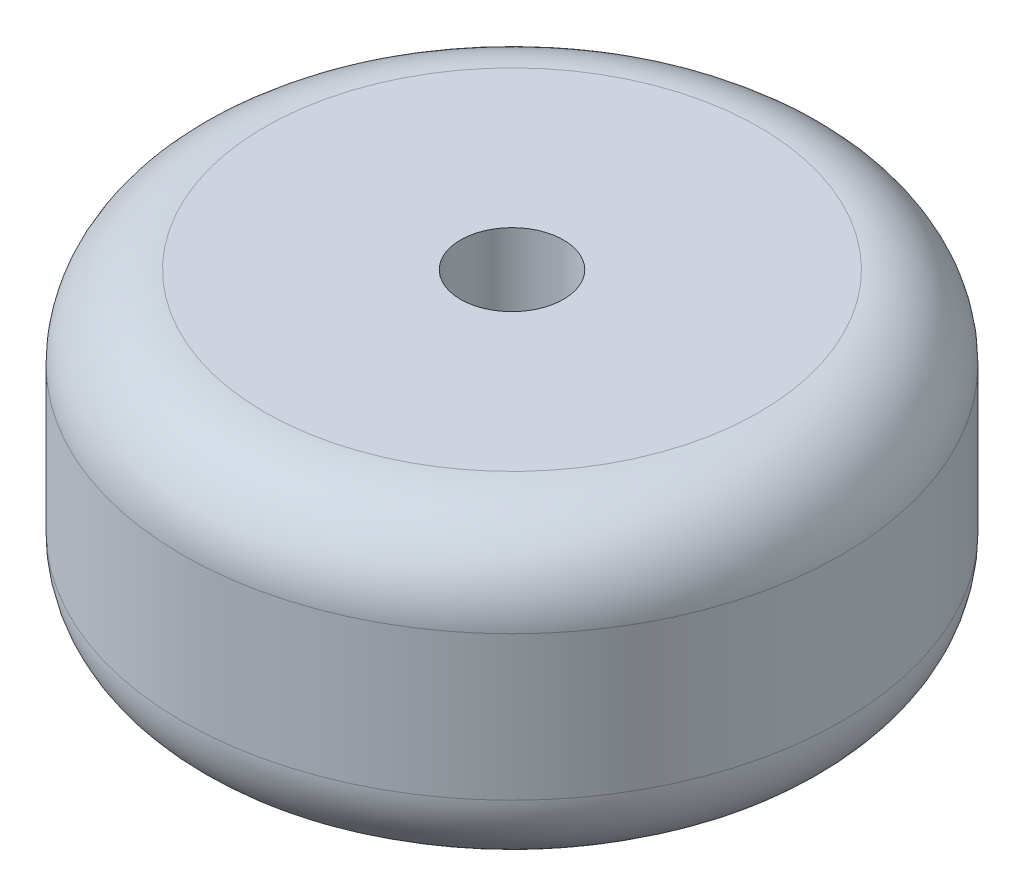
ISO-10303-21;
HEADER;
FILE_DESCRIPTION(('STEP AP214'),'2;1');
FILE_NAME('part.step','',(''),(''),'','','');
FILE_SCHEMA(('AUTOMOTIVE_DESIGN { 1 0 10303 214 1 1 1 1 }'));
ENDSEC;
DATA;
#1=APPLICATION_CONTEXT('core data for automotive mechanical design processes');
#2=APPLICATION_PROTOCOL_DEFINITION('international standard','automotive_design',2000,#1);
#3=PRODUCT_CONTEXT('',#1,'mechanical');
#4=PRODUCT('Part','Part','',(#3));
#5=PRODUCT_RELATED_PRODUCT_CATEGORY('part','',(#4));
#6=PRODUCT_DEFINITION_FORMATION('','',#4);
#7=PRODUCT_DEFINITION_CONTEXT('part definition',#1,'design');
#8=PRODUCT_DEFINITION('design','',#6,#7);
#9=PRODUCT_DEFINITION_SHAPE('','',#8);
#10=(LENGTH_UNIT() NAMED_UNIT(*) SI_UNIT(.MILLI.,.METRE.));
#11=(NAMED_UNIT(*) PLANE_ANGLE_UNIT() SI_UNIT($,.RADIAN.));
#12=(NAMED_UNIT(*) SI_UNIT($,.STERADIAN.) SOLID_ANGLE_UNIT());
#13=UNCERTAINTY_MEASURE_WITH_UNIT(LENGTH_MEASURE(1.E-05),#10,'distance_accuracy_value','');
#14=(GEOMETRIC_REPRESENTATION_CONTEXT(3) GLOBAL_UNCERTAINTY_ASSIGNED_CONTEXT((#13)) GLOBAL_UNIT_ASSIGNED_CONTEXT((#10,
#11,#12)) REPRESENTATION_CONTEXT('',''));
#15=CARTESIAN_POINT('',(0.,0.,0.));
#16=DIRECTION('',(0.,0.,1.));
#17=DIRECTION('',(1.,0.,0.));
#18=AXIS2_PLACEMENT_3D('',#15,#16,#17);
#19=CARTESIAN_POINT('',(0.,15.,0.));
#20=DIRECTION('',(0.,1.,0.));
#21=DIRECTION('',(0.,0.,1.));
#22=AXIS2_PLACEMENT_3D('',#19,#20,#21);
#23=PLANE('',#22);
#24=CARTESIAN_POINT('',(0.,15.,0.));
#25=DIRECTION('',(0.,1.,0.));
#26=DIRECTION('',(0.,0.,1.));
#27=AXIS2_PLACEMENT_3D('',#24,#25,#26);
#28=CIRCLE('',#27,12.);
#29=CARTESIAN_POINT('',(0.,15.,12.));
#30=VERTEX_POINT('',#29);
#31=EDGE_CURVE('E10',#30,#30,#28,.T.);
#32=ORIENTED_EDGE('',*,*,#31,.T.);
#33=EDGE_LOOP('',(#32));
#34=FACE_BOUND('',#33,.T.);
#35=CARTESIAN_POINT('',(0.,15.,0.));
#36=DIRECTION('',(0.,1.,0.));
#37=DIRECTION('',(0.,0.,1.));
#38=AXIS2_PLACEMENT_3D('',#35,#36,#37);
#39=CIRCLE('',#38,2.5);
#40=CARTESIAN_POINT('',(0.,15.,2.5));
#41=VERTEX_POINT('',#40);
#42=EDGE_CURVE('E61',#41,#41,#39,.T.);
#43=ORIENTED_EDGE('',*,*,#42,.F.);
#44=EDGE_LOOP('',(#43));
#45=FACE_BOUND('',#44,.T.);
#46=ADVANCED_FACE('F37',(#34,#45),#23,.T.);
#47=CARTESIAN_POINT('',(0.,0.,0.));
#48=DIRECTION('',(0.,1.,0.));
#49=DIRECTION('',(0.,0.,1.));
#50=AXIS2_PLACEMENT_3D('',#47,#48,#49);
#51=PLANE('',#50);
#52=CARTESIAN_POINT('',(0.,0.,0.));
#53=DIRECTION('',(0.,1.,0.));
#54=DIRECTION('',(0.,0.,1.));
#55=AXIS2_PLACEMENT_3D('',#52,#53,#54);
#56=CIRCLE('',#55,12.);
#57=CARTESIAN_POINT('',(0.,0.,12.));
#58=VERTEX_POINT('',#57);
#59=EDGE_CURVE('E45',#58,#58,#56,.F.);
#60=ORIENTED_EDGE('',*,*,#59,.T.);
#61=EDGE_LOOP('',(#60));
#62=FACE_BOUND('',#61,.T.);
#63=CARTESIAN_POINT('',(0.,0.,0.));
#64=DIRECTION('',(0.,1.,0.));
#65=DIRECTION('',(0.,0.,1.));
#66=AXIS2_PLACEMENT_3D('',#63,#64,#65);
#67=CIRCLE('',#66,2.5);
#68=CARTESIAN_POINT('',(0.,0.,2.5));
#69=VERTEX_POINT('',#68);
#70=EDGE_CURVE('E62',#69,#69,#67,.T.);
#71=ORIENTED_EDGE('',*,*,#70,.T.);
#72=EDGE_LOOP('',(#71));
#73=FACE_BOUND('',#72,.T.);
#74=ADVANCED_FACE('F74',(#62,#73),#51,.F.);
#75=CARTESIAN_POINT('',(0.,15.,0.));
#76=DIRECTION('',(0.,-1.,0.));
#77=DIRECTION('',(0.,0.,-1.));
#78=AXIS2_PLACEMENT_3D('',#75,#76,#77);
#79=CYLINDRICAL_SURFACE('',#78,16.);
#80=CARTESIAN_POINT('',(0.,4.,0.));
#81=DIRECTION('',(0.,1.,0.));
#82=DIRECTION('',(0.,0.,1.));
#83=AXIS2_PLACEMENT_3D('',#80,#81,#82);
#84=CIRCLE('',#83,16.);
#85=CARTESIAN_POINT('',(0.,4.,16.));
#86=VERTEX_POINT('',#85);
#87=EDGE_CURVE('E50',#86,#86,#84,.T.);
#88=ORIENTED_EDGE('',*,*,#87,.T.);
#89=EDGE_LOOP('',(#88));
#90=FACE_BOUND('',#89,.T.);
#91=CARTESIAN_POINT('',(0.,11.,0.));
#92=DIRECTION('',(0.,1.,0.));
#93=DIRECTION('',(0.,0.,1.));
#94=AXIS2_PLACEMENT_3D('',#91,#92,#93);
#95=CIRCLE('',#94,16.);
#96=CARTESIAN_POINT('',(0.,11.,16.));
#97=VERTEX_POINT('',#96);
#98=EDGE_CURVE('E55',#97,#97,#95,.F.);
#99=ORIENTED_EDGE('',*,*,#98,.T.);
#100=EDGE_LOOP('',(#99));
#101=FACE_BOUND('',#100,.T.);
#102=ADVANCED_FACE('F79',(#90,#101),#79,.T.);
#103=CARTESIAN_POINT('',(0.,15.,0.));
#104=DIRECTION('',(0.,-1.,0.));
#105=DIRECTION('',(0.,0.,-1.));
#106=AXIS2_PLACEMENT_3D('',#103,#104,#105);
#107=CYLINDRICAL_SURFACE('',#106,2.5);
#108=ORIENTED_EDGE('',*,*,#42,.T.);
#109=EDGE_LOOP('',(#108));
#110=FACE_BOUND('',#109,.T.);
#111=ORIENTED_EDGE('',*,*,#70,.F.);
#112=EDGE_LOOP('',(#111));
#113=FACE_BOUND('',#112,.T.);
#114=ADVANCED_FACE('F70',(#110,#113),#107,.F.);
#115=CARTESIAN_POINT('',(0.,4.,0.));
#116=DIRECTION('',(0.,1.,0.));
#117=DIRECTION('',(0.,0.,1.));
#118=AXIS2_PLACEMENT_3D('',#115,#116,#117);
#119=TOROIDAL_SURFACE('',#118,12.,4.);
#120=ORIENTED_EDGE('',*,*,#59,.F.);
#121=EDGE_LOOP('',(#120));
#122=FACE_BOUND('',#121,.T.);
#123=ORIENTED_EDGE('',*,*,#87,.F.);
#124=EDGE_LOOP('',(#123));
#125=FACE_BOUND('',#124,.T.);
#126=ADVANCED_FACE('F85',(#122,#125),#119,.T.);
#127=CARTESIAN_POINT('',(0.,11.,0.));
#128=DIRECTION('',(0.,1.,0.));
#129=DIRECTION('',(0.,0.,1.));
#130=AXIS2_PLACEMENT_3D('',#127,#128,#129);
#131=TOROIDAL_SURFACE('',#130,12.,4.);
#132=ORIENTED_EDGE('',*,*,#98,.F.);
#133=EDGE_LOOP('',(#132));
#134=FACE_BOUND('',#133,.T.);
#135=ORIENTED_EDGE('',*,*,#31,.F.);
#136=EDGE_LOOP('',(#135));
#137=FACE_BOUND('',#136,.T.);
#138=ADVANCED_FACE('F39',(#134,#137),#131,.T.);
#139=CLOSED_SHELL('',(#46,#74,#102,#114,#126,#138));
#140=MANIFOLD_SOLID_BREP('B2',#139);
#141=ADVANCED_BREP_SHAPE_REPRESENTATION('',(#18,#140),#14);
#142=SHAPE_DEFINITION_REPRESENTATION(#9,#141);
ENDSEC;
END-ISO-10303-21;
